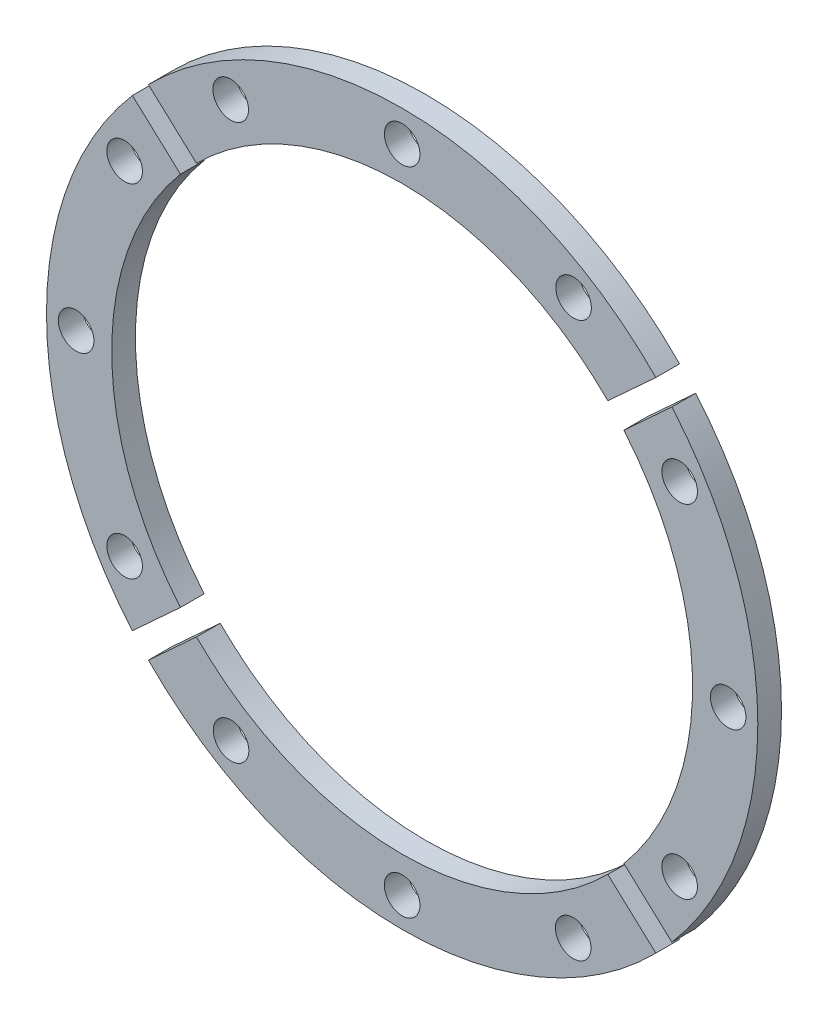
ISO-10303-21;
HEADER;
FILE_DESCRIPTION(('STEP AP214'),'2;1');
FILE_NAME('part.step','',(''),(''),'','','');
FILE_SCHEMA(('AUTOMOTIVE_DESIGN { 1 0 10303 214 1 1 1 1 }'));
ENDSEC;
DATA;
#1=APPLICATION_CONTEXT('core data for automotive mechanical design processes');
#2=APPLICATION_PROTOCOL_DEFINITION('international standard','automotive_design',2000,#1);
#3=PRODUCT_CONTEXT('',#1,'mechanical');
#4=PRODUCT('Part','Part','',(#3));
#5=PRODUCT_RELATED_PRODUCT_CATEGORY('part','',(#4));
#6=PRODUCT_DEFINITION_FORMATION('','',#4);
#7=PRODUCT_DEFINITION_CONTEXT('part definition',#1,'design');
#8=PRODUCT_DEFINITION('design','',#6,#7);
#9=PRODUCT_DEFINITION_SHAPE('','',#8);
#10=(LENGTH_UNIT() NAMED_UNIT(*) SI_UNIT(.MILLI.,.METRE.));
#11=(NAMED_UNIT(*) PLANE_ANGLE_UNIT() SI_UNIT($,.RADIAN.));
#12=(NAMED_UNIT(*) SI_UNIT($,.STERADIAN.) SOLID_ANGLE_UNIT());
#13=UNCERTAINTY_MEASURE_WITH_UNIT(LENGTH_MEASURE(1.E-05),#10,'distance_accuracy_value','');
#14=(GEOMETRIC_REPRESENTATION_CONTEXT(3) GLOBAL_UNCERTAINTY_ASSIGNED_CONTEXT((#13)) GLOBAL_UNIT_ASSIGNED_CONTEXT((#10,
#11,#12)) REPRESENTATION_CONTEXT('',''));
#15=CARTESIAN_POINT('',(0.,0.,0.));
#16=DIRECTION('',(0.,0.,1.));
#17=DIRECTION('',(1.,0.,0.));
#18=AXIS2_PLACEMENT_3D('',#15,#16,#17);
#19=CARTESIAN_POINT('',(0.,0.,20.));
#20=DIRECTION('',(0.,0.,-1.));
#21=DIRECTION('',(-1.,0.,0.));
#22=AXIS2_PLACEMENT_3D('',#19,#20,#21);
#23=CYLINDRICAL_SURFACE('',#22,245.);
#24=CARTESIAN_POINT('',(0.,0.,0.));
#25=DIRECTION('',(0.,0.,1.));
#26=DIRECTION('',(1.,0.,0.));
#27=AXIS2_PLACEMENT_3D('',#24,#25,#26);
#28=CIRCLE('',#27,245.);
#29=CARTESIAN_POINT('',(-173.489080918712,-172.992886564682,0.));
#30=VERTEX_POINT('',#29);
#31=CARTESIAN_POINT('',(173.489080918712,-172.992886564682,0.));
#32=VERTEX_POINT('',#31);
#33=EDGE_CURVE('E218',#30,#32,#28,.T.);
#34=ORIENTED_EDGE('',*,*,#33,.F.);
#35=DIRECTION('',(0.,0.,-1.));
#36=VECTOR('',#35,1.);
#37=CARTESIAN_POINT('',(-173.489080918712,-172.992886564682,20.));
#38=LINE('',#37,#36);
#39=CARTESIAN_POINT('',(-173.489080918712,-172.992886564682,20.));
#40=VERTEX_POINT('',#39);
#41=EDGE_CURVE('E13',#40,#30,#38,.T.);
#42=ORIENTED_EDGE('',*,*,#41,.F.);
#43=CARTESIAN_POINT('',(0.,0.,20.));
#44=DIRECTION('',(0.,0.,1.));
#45=DIRECTION('',(1.,0.,0.));
#46=AXIS2_PLACEMENT_3D('',#43,#44,#45);
#47=CIRCLE('',#46,245.);
#48=CARTESIAN_POINT('',(173.489080918712,-172.992886564682,20.));
#49=VERTEX_POINT('',#48);
#50=EDGE_CURVE('E202',#40,#49,#47,.T.);
#51=ORIENTED_EDGE('',*,*,#50,.T.);
#52=DIRECTION('',(0.,0.,-1.));
#53=VECTOR('',#52,1.);
#54=CARTESIAN_POINT('',(173.489080918712,-172.992886564682,20.));
#55=LINE('',#54,#53);
#56=EDGE_CURVE('E181',#49,#32,#55,.T.);
#57=ORIENTED_EDGE('',*,*,#56,.T.);
#58=EDGE_LOOP('',(#34,#42,#51,#57));
#59=FACE_BOUND('',#58,.T.);
#60=ADVANCED_FACE('F141',(#59),#23,.F.);
#61=CARTESIAN_POINT('',(6.76602199283932,-7.3634873797958,20.));
#62=DIRECTION('',(-0.676602199283941,0.73634873797959,0.));
#63=DIRECTION('',(-0.73634873797959,-0.676602199283941,0.));
#64=AXIS2_PLACEMENT_3D('',#61,#62,#63);
#65=PLANE('',#64);
#66=DIRECTION('',(0.73634873797959,0.676602199283941,0.));
#67=VECTOR('',#66,1.);
#68=CARTESIAN_POINT('',(6.76602199283932,-7.3634873797958,0.));
#69=LINE('',#68,#67);
#70=CARTESIAN_POINT('',(-214.015840502203,-210.231348790174,0.));
#71=VERTEX_POINT('',#70);
#72=EDGE_CURVE('E193',#71,#30,#69,.T.);
#73=ORIENTED_EDGE('',*,*,#72,.F.);
#74=DIRECTION('',(0.,0.,-1.));
#75=VECTOR('',#74,1.);
#76=CARTESIAN_POINT('',(-214.015840502203,-210.231348790174,20.));
#77=LINE('',#76,#75);
#78=CARTESIAN_POINT('',(-214.015840502203,-210.231348790174,20.));
#79=VERTEX_POINT('',#78);
#80=EDGE_CURVE('E150',#79,#71,#77,.T.);
#81=ORIENTED_EDGE('',*,*,#80,.F.);
#82=DIRECTION('',(0.73634873797959,0.676602199283941,0.));
#83=VECTOR('',#82,1.);
#84=CARTESIAN_POINT('',(6.76602199283932,-7.3634873797958,20.));
#85=LINE('',#84,#83);
#86=EDGE_CURVE('E191',#79,#40,#85,.T.);
#87=ORIENTED_EDGE('',*,*,#86,.T.);
#88=ORIENTED_EDGE('',*,*,#41,.T.);
#89=EDGE_LOOP('',(#73,#81,#87,#88));
#90=FACE_BOUND('',#89,.T.);
#91=ADVANCED_FACE('F189',(#90),#65,.T.);
#92=CARTESIAN_POINT('',(0.,0.,20.));
#93=DIRECTION('',(0.,0.,-1.));
#94=DIRECTION('',(-1.,0.,0.));
#95=AXIS2_PLACEMENT_3D('',#92,#93,#94);
#96=CYLINDRICAL_SURFACE('',#95,300.);
#97=CARTESIAN_POINT('',(0.,0.,0.));
#98=DIRECTION('',(0.,0.,1.));
#99=DIRECTION('',(1.,0.,0.));
#100=AXIS2_PLACEMENT_3D('',#97,#98,#99);
#101=CIRCLE('',#100,300.);
#102=CARTESIAN_POINT('',(214.015840502203,-210.231348790174,0.));
#103=VERTEX_POINT('',#102);
#104=EDGE_CURVE('E221',#71,#103,#101,.T.);
#105=ORIENTED_EDGE('',*,*,#104,.T.);
#106=DIRECTION('',(0.,0.,-1.));
#107=VECTOR('',#106,1.);
#108=CARTESIAN_POINT('',(214.015840502203,-210.231348790174,20.));
#109=LINE('',#108,#107);
#110=CARTESIAN_POINT('',(214.015840502203,-210.231348790174,20.));
#111=VERTEX_POINT('',#110);
#112=EDGE_CURVE('E196',#111,#103,#109,.T.);
#113=ORIENTED_EDGE('',*,*,#112,.F.);
#114=CARTESIAN_POINT('',(0.,0.,20.));
#115=DIRECTION('',(0.,0.,1.));
#116=DIRECTION('',(1.,0.,0.));
#117=AXIS2_PLACEMENT_3D('',#114,#115,#116);
#118=CIRCLE('',#117,300.);
#119=EDGE_CURVE('E198',#79,#111,#118,.T.);
#120=ORIENTED_EDGE('',*,*,#119,.F.);
#121=ORIENTED_EDGE('',*,*,#80,.T.);
#122=EDGE_LOOP('',(#105,#113,#120,#121));
#123=FACE_BOUND('',#122,.T.);
#124=ADVANCED_FACE('F199',(#123),#96,.T.);
#125=CARTESIAN_POINT('',(0.,-275.,20.));
#126=DIRECTION('',(0.,0.,-1.));
#127=DIRECTION('',(-1.,0.,0.));
#128=AXIS2_PLACEMENT_3D('',#125,#126,#127);
#129=CYLINDRICAL_SURFACE('',#128,15.);
#130=CARTESIAN_POINT('',(0.,-275.,20.));
#131=DIRECTION('',(0.,0.,1.));
#132=DIRECTION('',(1.,0.,0.));
#133=AXIS2_PLACEMENT_3D('',#130,#131,#132);
#134=CIRCLE('',#133,15.);
#135=CARTESIAN_POINT('',(15.,-275.,20.));
#136=VERTEX_POINT('',#135);
#137=EDGE_CURVE('E204',#136,#136,#134,.T.);
#138=ORIENTED_EDGE('',*,*,#137,.T.);
#139=EDGE_LOOP('',(#138));
#140=FACE_BOUND('',#139,.T.);
#141=CARTESIAN_POINT('',(0.,-275.,0.));
#142=DIRECTION('',(0.,0.,1.));
#143=DIRECTION('',(1.,0.,0.));
#144=AXIS2_PLACEMENT_3D('',#141,#142,#143);
#145=CIRCLE('',#144,15.);
#146=CARTESIAN_POINT('',(15.,-275.,0.));
#147=VERTEX_POINT('',#146);
#148=EDGE_CURVE('E215',#147,#147,#145,.T.);
#149=ORIENTED_EDGE('',*,*,#148,.F.);
#150=EDGE_LOOP('',(#149));
#151=FACE_BOUND('',#150,.T.);
#152=ADVANCED_FACE('F237',(#140,#151),#129,.F.);
#153=CARTESIAN_POINT('',(144.31370787625,-234.090909090909,20.));
#154=DIRECTION('',(0.,0.,-1.));
#155=DIRECTION('',(-1.,0.,0.));
#156=AXIS2_PLACEMENT_3D('',#153,#154,#155);
#157=CYLINDRICAL_SURFACE('',#156,15.);
#158=CARTESIAN_POINT('',(144.31370787625,-234.090909090909,20.));
#159=DIRECTION('',(0.,0.,1.));
#160=DIRECTION('',(1.,0.,0.));
#161=AXIS2_PLACEMENT_3D('',#158,#159,#160);
#162=CIRCLE('',#161,15.);
#163=CARTESIAN_POINT('',(159.31370787625,-234.090909090909,20.));
#164=VERTEX_POINT('',#163);
#165=EDGE_CURVE('E250',#164,#164,#162,.T.);
#166=ORIENTED_EDGE('',*,*,#165,.T.);
#167=EDGE_LOOP('',(#166));
#168=FACE_BOUND('',#167,.T.);
#169=CARTESIAN_POINT('',(144.31370787625,-234.090909090909,0.));
#170=DIRECTION('',(0.,0.,1.));
#171=DIRECTION('',(1.,0.,0.));
#172=AXIS2_PLACEMENT_3D('',#169,#170,#171);
#173=CIRCLE('',#172,15.);
#174=CARTESIAN_POINT('',(159.31370787625,-234.090909090909,0.));
#175=VERTEX_POINT('',#174);
#176=EDGE_CURVE('E212',#175,#175,#173,.T.);
#177=ORIENTED_EDGE('',*,*,#176,.F.);
#178=EDGE_LOOP('',(#177));
#179=FACE_BOUND('',#178,.T.);
#180=ADVANCED_FACE('F239',(#168,#179),#157,.F.);
#181=CARTESIAN_POINT('',(-144.31370787625,-234.090909090909,20.));
#182=DIRECTION('',(0.,0.,-1.));
#183=DIRECTION('',(-1.,0.,0.));
#184=AXIS2_PLACEMENT_3D('',#181,#182,#183);
#185=CYLINDRICAL_SURFACE('',#184,15.);
#186=CARTESIAN_POINT('',(-144.31370787625,-234.090909090909,20.));
#187=DIRECTION('',(0.,0.,1.));
#188=DIRECTION('',(1.,0.,0.));
#189=AXIS2_PLACEMENT_3D('',#186,#187,#188);
#190=CIRCLE('',#189,15.);
#191=CARTESIAN_POINT('',(-129.31370787625,-234.090909090909,20.));
#192=VERTEX_POINT('',#191);
#193=EDGE_CURVE('E224',#192,#192,#190,.T.);
#194=ORIENTED_EDGE('',*,*,#193,.T.);
#195=EDGE_LOOP('',(#194));
#196=FACE_BOUND('',#195,.T.);
#197=CARTESIAN_POINT('',(-144.31370787625,-234.090909090909,0.));
#198=DIRECTION('',(0.,0.,1.));
#199=DIRECTION('',(1.,0.,0.));
#200=AXIS2_PLACEMENT_3D('',#197,#198,#199);
#201=CIRCLE('',#200,15.);
#202=CARTESIAN_POINT('',(-129.31370787625,-234.090909090909,0.));
#203=VERTEX_POINT('',#202);
#204=EDGE_CURVE('E209',#203,#203,#201,.T.);
#205=ORIENTED_EDGE('',*,*,#204,.F.);
#206=EDGE_LOOP('',(#205));
#207=FACE_BOUND('',#206,.T.);
#208=ADVANCED_FACE('F143',(#196,#207),#185,.F.);
#209=CARTESIAN_POINT('',(-6.76602199283932,-7.3634873797958,20.));
#210=DIRECTION('',(-0.676602199283941,-0.73634873797959,0.));
#211=DIRECTION('',(0.73634873797959,-0.676602199283941,0.));
#212=AXIS2_PLACEMENT_3D('',#209,#210,#211);
#213=PLANE('',#212);
#214=DIRECTION('',(-0.73634873797959,0.676602199283941,0.));
#215=VECTOR('',#214,1.);
#216=CARTESIAN_POINT('',(-6.76602199283932,-7.3634873797958,0.));
#217=LINE('',#216,#215);
#218=EDGE_CURVE('E174',#103,#32,#217,.T.);
#219=ORIENTED_EDGE('',*,*,#218,.T.);
#220=ORIENTED_EDGE('',*,*,#56,.F.);
#221=DIRECTION('',(-0.73634873797959,0.676602199283941,0.));
#222=VECTOR('',#221,1.);
#223=CARTESIAN_POINT('',(-6.76602199283932,-7.3634873797958,20.));
#224=LINE('',#223,#222);
#225=EDGE_CURVE('E158',#111,#49,#224,.T.);
#226=ORIENTED_EDGE('',*,*,#225,.F.);
#227=ORIENTED_EDGE('',*,*,#112,.T.);
#228=EDGE_LOOP('',(#219,#220,#226,#227));
#229=FACE_BOUND('',#228,.T.);
#230=ADVANCED_FACE('F227',(#229),#213,.F.);
#231=CARTESIAN_POINT('',(0.,0.,20.));
#232=DIRECTION('',(0.,0.,1.));
#233=DIRECTION('',(1.,0.,0.));
#234=AXIS2_PLACEMENT_3D('',#231,#232,#233);
#235=PLANE('',#234);
#236=ORIENTED_EDGE('',*,*,#193,.F.);
#237=EDGE_LOOP('',(#236));
#238=FACE_BOUND('',#237,.T.);
#239=ORIENTED_EDGE('',*,*,#165,.F.);
#240=EDGE_LOOP('',(#239));
#241=FACE_BOUND('',#240,.T.);
#242=ORIENTED_EDGE('',*,*,#137,.F.);
#243=EDGE_LOOP('',(#242));
#244=FACE_BOUND('',#243,.T.);
#245=ORIENTED_EDGE('',*,*,#50,.F.);
#246=ORIENTED_EDGE('',*,*,#86,.F.);
#247=ORIENTED_EDGE('',*,*,#119,.T.);
#248=ORIENTED_EDGE('',*,*,#225,.T.);
#249=EDGE_LOOP('',(#245,#246,#247,#248));
#250=FACE_BOUND('',#249,.T.);
#251=ADVANCED_FACE('F201',(#238,#241,#244,#250),#235,.T.);
#252=CARTESIAN_POINT('',(0.,0.,0.));
#253=DIRECTION('',(0.,0.,1.));
#254=DIRECTION('',(1.,0.,0.));
#255=AXIS2_PLACEMENT_3D('',#252,#253,#254);
#256=PLANE('',#255);
#257=ORIENTED_EDGE('',*,*,#204,.T.);
#258=EDGE_LOOP('',(#257));
#259=FACE_BOUND('',#258,.T.);
#260=ORIENTED_EDGE('',*,*,#176,.T.);
#261=EDGE_LOOP('',(#260));
#262=FACE_BOUND('',#261,.T.);
#263=ORIENTED_EDGE('',*,*,#148,.T.);
#264=EDGE_LOOP('',(#263));
#265=FACE_BOUND('',#264,.T.);
#266=ORIENTED_EDGE('',*,*,#33,.T.);
#267=ORIENTED_EDGE('',*,*,#218,.F.);
#268=ORIENTED_EDGE('',*,*,#104,.F.);
#269=ORIENTED_EDGE('',*,*,#72,.T.);
#270=EDGE_LOOP('',(#266,#267,#268,#269));
#271=FACE_BOUND('',#270,.T.);
#272=ADVANCED_FACE('F228',(#259,#262,#265,#271),#256,.F.);
#273=CLOSED_SHELL('',(#60,#91,#124,#152,#180,#208,#230,#251,#272));
#274=MANIFOLD_SOLID_BREP('B2',#273);
#275=CARTESIAN_POINT('',(6.76602199283945,7.36348737979595,20.));
#276=DIRECTION('',(-0.67660219928394,-0.73634873797959,0.));
#277=DIRECTION('',(0.73634873797959,-0.67660219928394,0.));
#278=AXIS2_PLACEMENT_3D('',#275,#276,#277);
#279=PLANE('',#278);
#280=DIRECTION('',(-0.73634873797959,0.67660219928394,0.));
#281=VECTOR('',#280,1.);
#282=CARTESIAN_POINT('',(6.76602199283945,7.36348737979595,0.));
#283=LINE('',#282,#281);
#284=CARTESIAN_POINT('',(227.547884487882,-195.504374030582,0.));
#285=VERTEX_POINT('',#284);
#286=CARTESIAN_POINT('',(187.02112490439,-158.26591180509,0.));
#287=VERTEX_POINT('',#286);
#288=EDGE_CURVE('E408',#285,#287,#283,.T.);
#289=ORIENTED_EDGE('',*,*,#288,.F.);
#290=DIRECTION('',(0.,0.,-1.));
#291=VECTOR('',#290,1.);
#292=CARTESIAN_POINT('',(227.547884487882,-195.504374030582,20.));
#293=LINE('',#292,#291);
#294=CARTESIAN_POINT('',(227.547884487882,-195.504374030582,20.));
#295=VERTEX_POINT('',#294);
#296=EDGE_CURVE('E139',#295,#285,#293,.T.);
#297=ORIENTED_EDGE('',*,*,#296,.F.);
#298=DIRECTION('',(-0.73634873797959,0.67660219928394,0.));
#299=VECTOR('',#298,1.);
#300=CARTESIAN_POINT('',(6.76602199283945,7.36348737979595,20.));
#301=LINE('',#300,#299);
#302=CARTESIAN_POINT('',(187.02112490439,-158.26591180509,20.));
#303=VERTEX_POINT('',#302);
#304=EDGE_CURVE('E392',#295,#303,#301,.T.);
#305=ORIENTED_EDGE('',*,*,#304,.T.);
#306=DIRECTION('',(0.,0.,-1.));
#307=VECTOR('',#306,1.);
#308=CARTESIAN_POINT('',(187.02112490439,-158.26591180509,20.));
#309=LINE('',#308,#307);
#310=EDGE_CURVE('E354',#303,#287,#309,.T.);
#311=ORIENTED_EDGE('',*,*,#310,.T.);
#312=EDGE_LOOP('',(#289,#297,#305,#311));
#313=FACE_BOUND('',#312,.T.);
#314=ADVANCED_FACE('F337',(#313),#279,.T.);
#315=CARTESIAN_POINT('',(0.,0.,20.));
#316=DIRECTION('',(0.,0.,-1.));
#317=DIRECTION('',(-1.,0.,0.));
#318=AXIS2_PLACEMENT_3D('',#315,#316,#317);
#319=CYLINDRICAL_SURFACE('',#318,300.);
#320=CARTESIAN_POINT('',(0.,0.,0.));
#321=DIRECTION('',(0.,0.,1.));
#322=DIRECTION('',(1.,0.,0.));
#323=AXIS2_PLACEMENT_3D('',#320,#321,#322);
#324=CIRCLE('',#323,300.);
#325=CARTESIAN_POINT('',(227.547884487882,195.504374030582,0.));
#326=VERTEX_POINT('',#325);
#327=EDGE_CURVE('E397',#285,#326,#324,.T.);
#328=ORIENTED_EDGE('',*,*,#327,.T.);
#329=DIRECTION('',(0.,0.,-1.));
#330=VECTOR('',#329,1.);
#331=CARTESIAN_POINT('',(227.547884487882,195.504374030582,20.));
#332=LINE('',#331,#330);
#333=CARTESIAN_POINT('',(227.547884487882,195.504374030582,20.));
#334=VERTEX_POINT('',#333);
#335=EDGE_CURVE('E346',#334,#326,#332,.T.);
#336=ORIENTED_EDGE('',*,*,#335,.F.);
#337=CARTESIAN_POINT('',(0.,0.,20.));
#338=DIRECTION('',(0.,0.,1.));
#339=DIRECTION('',(1.,0.,0.));
#340=AXIS2_PLACEMENT_3D('',#337,#338,#339);
#341=CIRCLE('',#340,300.);
#342=EDGE_CURVE('E388',#295,#334,#341,.T.);
#343=ORIENTED_EDGE('',*,*,#342,.F.);
#344=ORIENTED_EDGE('',*,*,#296,.T.);
#345=EDGE_LOOP('',(#328,#336,#343,#344));
#346=FACE_BOUND('',#345,.T.);
#347=ADVANCED_FACE('F395',(#346),#319,.T.);
#348=CARTESIAN_POINT('',(6.76602199283945,-7.36348737979595,20.));
#349=DIRECTION('',(0.67660219928394,-0.73634873797959,0.));
#350=DIRECTION('',(0.73634873797959,0.67660219928394,0.));
#351=AXIS2_PLACEMENT_3D('',#348,#349,#350);
#352=PLANE('',#351);
#353=DIRECTION('',(-0.73634873797959,-0.67660219928394,0.));
#354=VECTOR('',#353,1.);
#355=CARTESIAN_POINT('',(6.76602199283945,-7.36348737979595,0.));
#356=LINE('',#355,#354);
#357=CARTESIAN_POINT('',(187.02112490439,158.26591180509,0.));
#358=VERTEX_POINT('',#357);
#359=EDGE_CURVE('E405',#326,#358,#356,.T.);
#360=ORIENTED_EDGE('',*,*,#359,.T.);
#361=DIRECTION('',(0.,0.,-1.));
#362=VECTOR('',#361,1.);
#363=CARTESIAN_POINT('',(187.02112490439,158.26591180509,20.));
#364=LINE('',#363,#362);
#365=CARTESIAN_POINT('',(187.02112490439,158.26591180509,20.));
#366=VERTEX_POINT('',#365);
#367=EDGE_CURVE('E368',#366,#358,#364,.T.);
#368=ORIENTED_EDGE('',*,*,#367,.F.);
#369=DIRECTION('',(-0.73634873797959,-0.67660219928394,0.));
#370=VECTOR('',#369,1.);
#371=CARTESIAN_POINT('',(6.76602199283945,-7.36348737979595,20.));
#372=LINE('',#371,#370);
#373=EDGE_CURVE('E380',#334,#366,#372,.T.);
#374=ORIENTED_EDGE('',*,*,#373,.F.);
#375=ORIENTED_EDGE('',*,*,#335,.T.);
#376=EDGE_LOOP('',(#360,#368,#374,#375));
#377=FACE_BOUND('',#376,.T.);
#378=ADVANCED_FACE('F382',(#377),#352,.F.);
#379=CARTESIAN_POINT('',(234.090909090909,-144.31370787625,20.));
#380=DIRECTION('',(0.,0.,-1.));
#381=DIRECTION('',(-1.,0.,0.));
#382=AXIS2_PLACEMENT_3D('',#379,#380,#381);
#383=CYLINDRICAL_SURFACE('',#382,15.);
#384=CARTESIAN_POINT('',(234.090909090909,-144.31370787625,20.));
#385=DIRECTION('',(0.,0.,1.));
#386=DIRECTION('',(1.,0.,0.));
#387=AXIS2_PLACEMENT_3D('',#384,#385,#386);
#388=CIRCLE('',#387,15.);
#389=CARTESIAN_POINT('',(249.090909090909,-144.31370787625,20.));
#390=VERTEX_POINT('',#389);
#391=EDGE_CURVE('E421',#390,#390,#388,.T.);
#392=ORIENTED_EDGE('',*,*,#391,.T.);
#393=EDGE_LOOP('',(#392));
#394=FACE_BOUND('',#393,.T.);
#395=CARTESIAN_POINT('',(234.090909090909,-144.31370787625,0.));
#396=DIRECTION('',(0.,0.,1.));
#397=DIRECTION('',(1.,0.,0.));
#398=AXIS2_PLACEMENT_3D('',#395,#396,#397);
#399=CIRCLE('',#398,15.);
#400=CARTESIAN_POINT('',(249.090909090909,-144.31370787625,0.));
#401=VERTEX_POINT('',#400);
#402=EDGE_CURVE('E410',#401,#401,#399,.T.);
#403=ORIENTED_EDGE('',*,*,#402,.F.);
#404=EDGE_LOOP('',(#403));
#405=FACE_BOUND('',#404,.T.);
#406=ADVANCED_FACE('F441',(#394,#405),#383,.F.);
#407=CARTESIAN_POINT('',(234.090909090909,144.31370787625,20.));
#408=DIRECTION('',(0.,0.,-1.));
#409=DIRECTION('',(-1.,0.,0.));
#410=AXIS2_PLACEMENT_3D('',#407,#408,#409);
#411=CYLINDRICAL_SURFACE('',#410,15.);
#412=CARTESIAN_POINT('',(234.090909090909,144.31370787625,20.));
#413=DIRECTION('',(0.,0.,1.));
#414=DIRECTION('',(1.,0.,0.));
#415=AXIS2_PLACEMENT_3D('',#412,#413,#414);
#416=CIRCLE('',#415,15.);
#417=CARTESIAN_POINT('',(249.090909090909,144.31370787625,20.));
#418=VERTEX_POINT('',#417);
#419=EDGE_CURVE('E424',#418,#418,#416,.T.);
#420=ORIENTED_EDGE('',*,*,#419,.T.);
#421=EDGE_LOOP('',(#420));
#422=FACE_BOUND('',#421,.T.);
#423=CARTESIAN_POINT('',(234.090909090909,144.31370787625,0.));
#424=DIRECTION('',(0.,0.,1.));
#425=DIRECTION('',(1.,0.,0.));
#426=AXIS2_PLACEMENT_3D('',#423,#424,#425);
#427=CIRCLE('',#426,15.);
#428=CARTESIAN_POINT('',(249.090909090909,144.31370787625,0.));
#429=VERTEX_POINT('',#428);
#430=EDGE_CURVE('E413',#429,#429,#427,.T.);
#431=ORIENTED_EDGE('',*,*,#430,.F.);
#432=EDGE_LOOP('',(#431));
#433=FACE_BOUND('',#432,.T.);
#434=ADVANCED_FACE('F444',(#422,#433),#411,.F.);
#435=CARTESIAN_POINT('',(275.,0.,20.));
#436=DIRECTION('',(0.,0.,-1.));
#437=DIRECTION('',(-1.,0.,0.));
#438=AXIS2_PLACEMENT_3D('',#435,#436,#437);
#439=CYLINDRICAL_SURFACE('',#438,15.);
#440=CARTESIAN_POINT('',(275.,0.,20.));
#441=DIRECTION('',(0.,0.,1.));
#442=DIRECTION('',(1.,0.,0.));
#443=AXIS2_PLACEMENT_3D('',#440,#441,#442);
#444=CIRCLE('',#443,15.);
#445=CARTESIAN_POINT('',(290.,0.,20.));
#446=VERTEX_POINT('',#445);
#447=EDGE_CURVE('E404',#446,#446,#444,.T.);
#448=ORIENTED_EDGE('',*,*,#447,.T.);
#449=EDGE_LOOP('',(#448));
#450=FACE_BOUND('',#449,.T.);
#451=CARTESIAN_POINT('',(275.,0.,0.));
#452=DIRECTION('',(0.,0.,1.));
#453=DIRECTION('',(1.,0.,0.));
#454=AXIS2_PLACEMENT_3D('',#451,#452,#453);
#455=CIRCLE('',#454,15.);
#456=CARTESIAN_POINT('',(290.,0.,0.));
#457=VERTEX_POINT('',#456);
#458=EDGE_CURVE('E416',#457,#457,#455,.T.);
#459=ORIENTED_EDGE('',*,*,#458,.F.);
#460=EDGE_LOOP('',(#459));
#461=FACE_BOUND('',#460,.T.);
#462=ADVANCED_FACE('F339',(#450,#461),#439,.F.);
#463=CARTESIAN_POINT('',(0.,0.,20.));
#464=DIRECTION('',(0.,0.,-1.));
#465=DIRECTION('',(-1.,0.,0.));
#466=AXIS2_PLACEMENT_3D('',#463,#464,#465);
#467=CYLINDRICAL_SURFACE('',#466,245.);
#468=CARTESIAN_POINT('',(0.,0.,0.));
#469=DIRECTION('',(0.,0.,1.));
#470=DIRECTION('',(1.,0.,0.));
#471=AXIS2_PLACEMENT_3D('',#468,#469,#470);
#472=CIRCLE('',#471,245.);
#473=EDGE_CURVE('E401',#287,#358,#472,.T.);
#474=ORIENTED_EDGE('',*,*,#473,.F.);
#475=ORIENTED_EDGE('',*,*,#310,.F.);
#476=CARTESIAN_POINT('',(0.,0.,20.));
#477=DIRECTION('',(0.,0.,1.));
#478=DIRECTION('',(1.,0.,0.));
#479=AXIS2_PLACEMENT_3D('',#476,#477,#478);
#480=CIRCLE('',#479,245.);
#481=EDGE_CURVE('E387',#303,#366,#480,.T.);
#482=ORIENTED_EDGE('',*,*,#481,.T.);
#483=ORIENTED_EDGE('',*,*,#367,.T.);
#484=EDGE_LOOP('',(#474,#475,#482,#483));
#485=FACE_BOUND('',#484,.T.);
#486=ADVANCED_FACE('F435',(#485),#467,.F.);
#487=CARTESIAN_POINT('',(0.,0.,20.));
#488=DIRECTION('',(0.,0.,1.));
#489=DIRECTION('',(1.,0.,0.));
#490=AXIS2_PLACEMENT_3D('',#487,#488,#489);
#491=PLANE('',#490);
#492=ORIENTED_EDGE('',*,*,#447,.F.);
#493=EDGE_LOOP('',(#492));
#494=FACE_BOUND('',#493,.T.);
#495=ORIENTED_EDGE('',*,*,#419,.F.);
#496=EDGE_LOOP('',(#495));
#497=FACE_BOUND('',#496,.T.);
#498=ORIENTED_EDGE('',*,*,#391,.F.);
#499=EDGE_LOOP('',(#498));
#500=FACE_BOUND('',#499,.T.);
#501=ORIENTED_EDGE('',*,*,#304,.F.);
#502=ORIENTED_EDGE('',*,*,#342,.T.);
#503=ORIENTED_EDGE('',*,*,#373,.T.);
#504=ORIENTED_EDGE('',*,*,#481,.F.);
#505=EDGE_LOOP('',(#501,#502,#503,#504));
#506=FACE_BOUND('',#505,.T.);
#507=ADVANCED_FACE('F391',(#494,#497,#500,#506),#491,.T.);
#508=CARTESIAN_POINT('',(0.,0.,0.));
#509=DIRECTION('',(0.,0.,1.));
#510=DIRECTION('',(1.,0.,0.));
#511=AXIS2_PLACEMENT_3D('',#508,#509,#510);
#512=PLANE('',#511);
#513=ORIENTED_EDGE('',*,*,#458,.T.);
#514=EDGE_LOOP('',(#513));
#515=FACE_BOUND('',#514,.T.);
#516=ORIENTED_EDGE('',*,*,#430,.T.);
#517=EDGE_LOOP('',(#516));
#518=FACE_BOUND('',#517,.T.);
#519=ORIENTED_EDGE('',*,*,#402,.T.);
#520=EDGE_LOOP('',(#519));
#521=FACE_BOUND('',#520,.T.);
#522=ORIENTED_EDGE('',*,*,#288,.T.);
#523=ORIENTED_EDGE('',*,*,#473,.T.);
#524=ORIENTED_EDGE('',*,*,#359,.F.);
#525=ORIENTED_EDGE('',*,*,#327,.F.);
#526=EDGE_LOOP('',(#522,#523,#524,#525));
#527=FACE_BOUND('',#526,.T.);
#528=ADVANCED_FACE('F434',(#515,#518,#521,#527),#512,.F.);
#529=CLOSED_SHELL('',(#314,#347,#378,#406,#434,#462,#486,#507,#528));
#530=MANIFOLD_SOLID_BREP('B7',#529);
#531=CARTESIAN_POINT('',(0.,0.,20.));
#532=DIRECTION('',(0.,0.,-1.));
#533=DIRECTION('',(-1.,0.,0.));
#534=AXIS2_PLACEMENT_3D('',#531,#532,#533);
#535=CYLINDRICAL_SURFACE('',#534,245.);
#536=CARTESIAN_POINT('',(0.,0.,0.));
#537=DIRECTION('',(0.,0.,1.));
#538=DIRECTION('',(1.,0.,0.));
#539=AXIS2_PLACEMENT_3D('',#536,#537,#538);
#540=CIRCLE('',#539,245.);
#541=CARTESIAN_POINT('',(173.489080918712,172.992886564682,0.));
#542=VERTEX_POINT('',#541);
#543=CARTESIAN_POINT('',(-173.489080918712,172.992886564682,0.));
#544=VERTEX_POINT('',#543);
#545=EDGE_CURVE('E605',#542,#544,#540,.T.);
#546=ORIENTED_EDGE('',*,*,#545,.F.);
#547=DIRECTION('',(0.,0.,-1.));
#548=VECTOR('',#547,1.);
#549=CARTESIAN_POINT('',(173.489080918712,172.992886564682,20.));
#550=LINE('',#549,#548);
#551=CARTESIAN_POINT('',(173.489080918712,172.992886564682,20.));
#552=VERTEX_POINT('',#551);
#553=EDGE_CURVE('E335',#552,#542,#550,.T.);
#554=ORIENTED_EDGE('',*,*,#553,.F.);
#555=CARTESIAN_POINT('',(0.,0.,20.));
#556=DIRECTION('',(0.,0.,1.));
#557=DIRECTION('',(1.,0.,0.));
#558=AXIS2_PLACEMENT_3D('',#555,#556,#557);
#559=CIRCLE('',#558,245.);
#560=CARTESIAN_POINT('',(-173.489080918712,172.992886564682,20.));
#561=VERTEX_POINT('',#560);
#562=EDGE_CURVE('E590',#552,#561,#559,.T.);
#563=ORIENTED_EDGE('',*,*,#562,.T.);
#564=DIRECTION('',(0.,0.,-1.));
#565=VECTOR('',#564,1.);
#566=CARTESIAN_POINT('',(-173.489080918712,172.992886564682,20.));
#567=LINE('',#566,#565);
#568=EDGE_CURVE('E570',#561,#544,#567,.T.);
#569=ORIENTED_EDGE('',*,*,#568,.T.);
#570=EDGE_LOOP('',(#546,#554,#563,#569));
#571=FACE_BOUND('',#570,.T.);
#572=ADVANCED_FACE('F532',(#571),#535,.F.);
#573=CARTESIAN_POINT('',(-6.76602199283932,7.3634873797958,20.));
#574=DIRECTION('',(0.676602199283941,-0.73634873797959,0.));
#575=DIRECTION('',(0.73634873797959,0.676602199283941,0.));
#576=AXIS2_PLACEMENT_3D('',#573,#574,#575);
#577=PLANE('',#576);
#578=DIRECTION('',(-0.73634873797959,-0.676602199283941,0.));
#579=VECTOR('',#578,1.);
#580=CARTESIAN_POINT('',(-6.76602199283932,7.3634873797958,0.));
#581=LINE('',#580,#579);
#582=CARTESIAN_POINT('',(214.015840502203,210.231348790174,0.));
#583=VERTEX_POINT('',#582);
#584=EDGE_CURVE('E583',#583,#542,#581,.T.);
#585=ORIENTED_EDGE('',*,*,#584,.F.);
#586=DIRECTION('',(0.,0.,-1.));
#587=VECTOR('',#586,1.);
#588=CARTESIAN_POINT('',(214.015840502203,210.231348790174,20.));
#589=LINE('',#588,#587);
#590=CARTESIAN_POINT('',(214.015840502203,210.231348790174,20.));
#591=VERTEX_POINT('',#590);
#592=EDGE_CURVE('E540',#591,#583,#589,.T.);
#593=ORIENTED_EDGE('',*,*,#592,.F.);
#594=DIRECTION('',(-0.73634873797959,-0.676602199283941,0.));
#595=VECTOR('',#594,1.);
#596=CARTESIAN_POINT('',(-6.76602199283932,7.3634873797958,20.));
#597=LINE('',#596,#595);
#598=EDGE_CURVE('E581',#591,#552,#597,.T.);
#599=ORIENTED_EDGE('',*,*,#598,.T.);
#600=ORIENTED_EDGE('',*,*,#553,.T.);
#601=EDGE_LOOP('',(#585,#593,#599,#600));
#602=FACE_BOUND('',#601,.T.);
#603=ADVANCED_FACE('F579',(#602),#577,.T.);
#604=CARTESIAN_POINT('',(0.,0.,20.));
#605=DIRECTION('',(0.,0.,-1.));
#606=DIRECTION('',(-1.,0.,0.));
#607=AXIS2_PLACEMENT_3D('',#604,#605,#606);
#608=CYLINDRICAL_SURFACE('',#607,300.);
#609=CARTESIAN_POINT('',(0.,0.,0.));
#610=DIRECTION('',(0.,0.,1.));
#611=DIRECTION('',(1.,0.,0.));
#612=AXIS2_PLACEMENT_3D('',#609,#610,#611);
#613=CIRCLE('',#612,300.);
#614=CARTESIAN_POINT('',(-214.015840502203,210.231348790174,0.));
#615=VERTEX_POINT('',#614);
#616=EDGE_CURVE('E563',#583,#615,#613,.T.);
#617=ORIENTED_EDGE('',*,*,#616,.T.);
#618=DIRECTION('',(0.,0.,-1.));
#619=VECTOR('',#618,1.);
#620=CARTESIAN_POINT('',(-214.015840502203,210.231348790174,20.));
#621=LINE('',#620,#619);
#622=CARTESIAN_POINT('',(-214.015840502203,210.231348790174,20.));
#623=VERTEX_POINT('',#622);
#624=EDGE_CURVE('E584',#623,#615,#621,.T.);
#625=ORIENTED_EDGE('',*,*,#624,.F.);
#626=CARTESIAN_POINT('',(0.,0.,20.));
#627=DIRECTION('',(0.,0.,1.));
#628=DIRECTION('',(1.,0.,0.));
#629=AXIS2_PLACEMENT_3D('',#626,#627,#628);
#630=CIRCLE('',#629,300.);
#631=EDGE_CURVE('E585',#591,#623,#630,.T.);
#632=ORIENTED_EDGE('',*,*,#631,.F.);
#633=ORIENTED_EDGE('',*,*,#592,.T.);
#634=EDGE_LOOP('',(#617,#625,#632,#633));
#635=FACE_BOUND('',#634,.T.);
#636=ADVANCED_FACE('F586',(#635),#608,.T.);
#637=CARTESIAN_POINT('',(-144.598899786363,233.914852415518,20.));
#638=DIRECTION('',(0.,0.,-1.));
#639=DIRECTION('',(-1.,0.,0.));
#640=AXIS2_PLACEMENT_3D('',#637,#638,#639);
#641=CYLINDRICAL_SURFACE('',#640,15.);
#642=CARTESIAN_POINT('',(-144.598899786363,233.914852415518,20.));
#643=DIRECTION('',(0.,0.,1.));
#644=DIRECTION('',(1.,0.,0.));
#645=AXIS2_PLACEMENT_3D('',#642,#643,#644);
#646=CIRCLE('',#645,15.);
#647=CARTESIAN_POINT('',(-129.598899786363,233.914852415518,20.));
#648=VERTEX_POINT('',#647);
#649=EDGE_CURVE('E599',#648,#648,#646,.T.);
#650=ORIENTED_EDGE('',*,*,#649,.T.);
#651=EDGE_LOOP('',(#650));
#652=FACE_BOUND('',#651,.T.);
#653=CARTESIAN_POINT('',(-144.598899786363,233.914852415518,0.));
#654=DIRECTION('',(0.,0.,1.));
#655=DIRECTION('',(1.,0.,0.));
#656=AXIS2_PLACEMENT_3D('',#653,#654,#655);
#657=CIRCLE('',#656,15.);
#658=CARTESIAN_POINT('',(-129.598899786363,233.914852415518,0.));
#659=VERTEX_POINT('',#658);
#660=EDGE_CURVE('E615',#659,#659,#657,.T.);
#661=ORIENTED_EDGE('',*,*,#660,.F.);
#662=EDGE_LOOP('',(#661));
#663=FACE_BOUND('',#662,.T.);
#664=ADVANCED_FACE('F634',(#652,#663),#641,.F.);
#665=CARTESIAN_POINT('',(144.598899786363,233.914852415518,20.));
#666=DIRECTION('',(0.,0.,-1.));
#667=DIRECTION('',(-1.,0.,0.));
#668=AXIS2_PLACEMENT_3D('',#665,#666,#667);
#669=CYLINDRICAL_SURFACE('',#668,15.);
#670=CARTESIAN_POINT('',(144.598899786363,233.914852415518,20.));
#671=DIRECTION('',(0.,0.,1.));
#672=DIRECTION('',(1.,0.,0.));
#673=AXIS2_PLACEMENT_3D('',#670,#671,#672);
#674=CIRCLE('',#673,15.);
#675=CARTESIAN_POINT('',(159.598899786363,233.914852415518,20.));
#676=VERTEX_POINT('',#675);
#677=EDGE_CURVE('E596',#676,#676,#674,.T.);
#678=ORIENTED_EDGE('',*,*,#677,.T.);
#679=EDGE_LOOP('',(#678));
#680=FACE_BOUND('',#679,.T.);
#681=CARTESIAN_POINT('',(144.598899786363,233.914852415518,0.));
#682=DIRECTION('',(0.,0.,1.));
#683=DIRECTION('',(1.,0.,0.));
#684=AXIS2_PLACEMENT_3D('',#681,#682,#683);
#685=CIRCLE('',#684,15.);
#686=CARTESIAN_POINT('',(159.598899786363,233.914852415518,0.));
#687=VERTEX_POINT('',#686);
#688=EDGE_CURVE('E612',#687,#687,#685,.T.);
#689=ORIENTED_EDGE('',*,*,#688,.F.);
#690=EDGE_LOOP('',(#689));
#691=FACE_BOUND('',#690,.T.);
#692=ADVANCED_FACE('F640',(#680,#691),#669,.F.);
#693=CARTESIAN_POINT('',(6.76602199283932,7.3634873797958,20.));
#694=DIRECTION('',(0.676602199283941,0.73634873797959,0.));
#695=DIRECTION('',(-0.73634873797959,0.676602199283941,0.));
#696=AXIS2_PLACEMENT_3D('',#693,#694,#695);
#697=PLANE('',#696);
#698=DIRECTION('',(0.73634873797959,-0.676602199283941,0.));
#699=VECTOR('',#698,1.);
#700=CARTESIAN_POINT('',(6.76602199283932,7.3634873797958,0.));
#701=LINE('',#700,#699);
#702=EDGE_CURVE('E610',#615,#544,#701,.T.);
#703=ORIENTED_EDGE('',*,*,#702,.T.);
#704=ORIENTED_EDGE('',*,*,#568,.F.);
#705=DIRECTION('',(0.73634873797959,-0.676602199283941,0.));
#706=VECTOR('',#705,1.);
#707=CARTESIAN_POINT('',(6.76602199283932,7.3634873797958,20.));
#708=LINE('',#707,#706);
#709=EDGE_CURVE('E548',#623,#561,#708,.T.);
#710=ORIENTED_EDGE('',*,*,#709,.F.);
#711=ORIENTED_EDGE('',*,*,#624,.T.);
#712=EDGE_LOOP('',(#703,#704,#710,#711));
#713=FACE_BOUND('',#712,.T.);
#714=ADVANCED_FACE('F623',(#713),#697,.F.);
#715=CARTESIAN_POINT('',(0.,273.804176558367,20.));
#716=DIRECTION('',(0.,0.,-1.));
#717=DIRECTION('',(-1.,0.,0.));
#718=AXIS2_PLACEMENT_3D('',#715,#716,#717);
#719=CYLINDRICAL_SURFACE('',#718,15.);
#720=CARTESIAN_POINT('',(0.,273.804176558367,20.));
#721=DIRECTION('',(0.,0.,1.));
#722=DIRECTION('',(1.,0.,0.));
#723=AXIS2_PLACEMENT_3D('',#720,#721,#722);
#724=CIRCLE('',#723,15.);
#725=CARTESIAN_POINT('',(15.,273.804176558367,20.));
#726=VERTEX_POINT('',#725);
#727=EDGE_CURVE('E602',#726,#726,#724,.T.);
#728=ORIENTED_EDGE('',*,*,#727,.T.);
#729=EDGE_LOOP('',(#728));
#730=FACE_BOUND('',#729,.T.);
#731=CARTESIAN_POINT('',(0.,273.804176558367,0.));
#732=DIRECTION('',(0.,0.,1.));
#733=DIRECTION('',(1.,0.,0.));
#734=AXIS2_PLACEMENT_3D('',#731,#732,#733);
#735=CIRCLE('',#734,15.);
#736=CARTESIAN_POINT('',(15.,273.804176558367,0.));
#737=VERTEX_POINT('',#736);
#738=EDGE_CURVE('E592',#737,#737,#735,.T.);
#739=ORIENTED_EDGE('',*,*,#738,.F.);
#740=EDGE_LOOP('',(#739));
#741=FACE_BOUND('',#740,.T.);
#742=ADVANCED_FACE('F639',(#730,#741),#719,.F.);
#743=CARTESIAN_POINT('',(0.,0.,20.));
#744=DIRECTION('',(0.,0.,1.));
#745=DIRECTION('',(1.,0.,0.));
#746=AXIS2_PLACEMENT_3D('',#743,#744,#745);
#747=PLANE('',#746);
#748=ORIENTED_EDGE('',*,*,#562,.F.);
#749=ORIENTED_EDGE('',*,*,#598,.F.);
#750=ORIENTED_EDGE('',*,*,#631,.T.);
#751=ORIENTED_EDGE('',*,*,#709,.T.);
#752=EDGE_LOOP('',(#748,#749,#750,#751));
#753=FACE_BOUND('',#752,.T.);
#754=ORIENTED_EDGE('',*,*,#677,.F.);
#755=EDGE_LOOP('',(#754));
#756=FACE_BOUND('',#755,.T.);
#757=ORIENTED_EDGE('',*,*,#649,.F.);
#758=EDGE_LOOP('',(#757));
#759=FACE_BOUND('',#758,.T.);
#760=ORIENTED_EDGE('',*,*,#727,.F.);
#761=EDGE_LOOP('',(#760));
#762=FACE_BOUND('',#761,.T.);
#763=ADVANCED_FACE('F588',(#753,#756,#759,#762),#747,.T.);
#764=CARTESIAN_POINT('',(0.,0.,0.));
#765=DIRECTION('',(0.,0.,1.));
#766=DIRECTION('',(1.,0.,0.));
#767=AXIS2_PLACEMENT_3D('',#764,#765,#766);
#768=PLANE('',#767);
#769=ORIENTED_EDGE('',*,*,#545,.T.);
#770=ORIENTED_EDGE('',*,*,#702,.F.);
#771=ORIENTED_EDGE('',*,*,#616,.F.);
#772=ORIENTED_EDGE('',*,*,#584,.T.);
#773=EDGE_LOOP('',(#769,#770,#771,#772));
#774=FACE_BOUND('',#773,.T.);
#775=ORIENTED_EDGE('',*,*,#688,.T.);
#776=EDGE_LOOP('',(#775));
#777=FACE_BOUND('',#776,.T.);
#778=ORIENTED_EDGE('',*,*,#660,.T.);
#779=EDGE_LOOP('',(#778));
#780=FACE_BOUND('',#779,.T.);
#781=ORIENTED_EDGE('',*,*,#738,.T.);
#782=EDGE_LOOP('',(#781));
#783=FACE_BOUND('',#782,.T.);
#784=ADVANCED_FACE('F625',(#774,#777,#780,#783),#768,.F.);
#785=CLOSED_SHELL('',(#572,#603,#636,#664,#692,#714,#742,#763,#784));
#786=MANIFOLD_SOLID_BREP('B133',#785);
#787=CARTESIAN_POINT('',(-6.76602199283947,-7.36348737979597,20.));
#788=DIRECTION('',(0.676602199283941,0.73634873797959,0.));
#789=DIRECTION('',(-0.73634873797959,0.676602199283941,0.));
#790=AXIS2_PLACEMENT_3D('',#787,#788,#789);
#791=PLANE('',#790);
#792=DIRECTION('',(0.73634873797959,-0.676602199283941,0.));
#793=VECTOR('',#792,1.);
#794=CARTESIAN_POINT('',(-6.76602199283947,-7.36348737979597,0.));
#795=LINE('',#794,#793);
#796=CARTESIAN_POINT('',(-227.547884487882,195.504374030582,0.));
#797=VERTEX_POINT('',#796);
#798=CARTESIAN_POINT('',(-187.02112490439,158.26591180509,0.));
#799=VERTEX_POINT('',#798);
#800=EDGE_CURVE('E789',#797,#799,#795,.T.);
#801=ORIENTED_EDGE('',*,*,#800,.F.);
#802=DIRECTION('',(0.,0.,-1.));
#803=VECTOR('',#802,1.);
#804=CARTESIAN_POINT('',(-227.547884487882,195.504374030582,20.));
#805=LINE('',#804,#803);
#806=CARTESIAN_POINT('',(-227.547884487882,195.504374030582,20.));
#807=VERTEX_POINT('',#806);
#808=EDGE_CURVE('E530',#807,#797,#805,.T.);
#809=ORIENTED_EDGE('',*,*,#808,.F.);
#810=DIRECTION('',(0.73634873797959,-0.676602199283941,0.));
#811=VECTOR('',#810,1.);
#812=CARTESIAN_POINT('',(-6.76602199283947,-7.36348737979597,20.));
#813=LINE('',#812,#811);
#814=CARTESIAN_POINT('',(-187.02112490439,158.26591180509,20.));
#815=VERTEX_POINT('',#814);
#816=EDGE_CURVE('E773',#807,#815,#813,.T.);
#817=ORIENTED_EDGE('',*,*,#816,.T.);
#818=DIRECTION('',(0.,0.,-1.));
#819=VECTOR('',#818,1.);
#820=CARTESIAN_POINT('',(-187.02112490439,158.26591180509,20.));
#821=LINE('',#820,#819);
#822=EDGE_CURVE('E735',#815,#799,#821,.T.);
#823=ORIENTED_EDGE('',*,*,#822,.T.);
#824=EDGE_LOOP('',(#801,#809,#817,#823));
#825=FACE_BOUND('',#824,.T.);
#826=ADVANCED_FACE('F718',(#825),#791,.T.);
#827=CARTESIAN_POINT('',(0.,0.,20.));
#828=DIRECTION('',(0.,0.,-1.));
#829=DIRECTION('',(-1.,0.,0.));
#830=AXIS2_PLACEMENT_3D('',#827,#828,#829);
#831=CYLINDRICAL_SURFACE('',#830,300.);
#832=CARTESIAN_POINT('',(0.,0.,0.));
#833=DIRECTION('',(0.,0.,1.));
#834=DIRECTION('',(1.,0.,0.));
#835=AXIS2_PLACEMENT_3D('',#832,#833,#834);
#836=CIRCLE('',#835,300.);
#837=CARTESIAN_POINT('',(-227.547884487882,-195.504374030582,0.));
#838=VERTEX_POINT('',#837);
#839=EDGE_CURVE('E778',#797,#838,#836,.T.);
#840=ORIENTED_EDGE('',*,*,#839,.T.);
#841=DIRECTION('',(0.,0.,-1.));
#842=VECTOR('',#841,1.);
#843=CARTESIAN_POINT('',(-227.547884487882,-195.504374030582,20.));
#844=LINE('',#843,#842);
#845=CARTESIAN_POINT('',(-227.547884487882,-195.504374030582,20.));
#846=VERTEX_POINT('',#845);
#847=EDGE_CURVE('E727',#846,#838,#844,.T.);
#848=ORIENTED_EDGE('',*,*,#847,.F.);
#849=CARTESIAN_POINT('',(0.,0.,20.));
#850=DIRECTION('',(0.,0.,1.));
#851=DIRECTION('',(1.,0.,0.));
#852=AXIS2_PLACEMENT_3D('',#849,#850,#851);
#853=CIRCLE('',#852,300.);
#854=EDGE_CURVE('E769',#807,#846,#853,.T.);
#855=ORIENTED_EDGE('',*,*,#854,.F.);
#856=ORIENTED_EDGE('',*,*,#808,.T.);
#857=EDGE_LOOP('',(#840,#848,#855,#856));
#858=FACE_BOUND('',#857,.T.);
#859=ADVANCED_FACE('F776',(#858),#831,.T.);
#860=CARTESIAN_POINT('',(-6.76602199283947,7.36348737979597,20.));
#861=DIRECTION('',(-0.676602199283941,0.73634873797959,0.));
#862=DIRECTION('',(-0.73634873797959,-0.676602199283941,0.));
#863=AXIS2_PLACEMENT_3D('',#860,#861,#862);
#864=PLANE('',#863);
#865=DIRECTION('',(0.73634873797959,0.676602199283941,0.));
#866=VECTOR('',#865,1.);
#867=CARTESIAN_POINT('',(-6.76602199283947,7.36348737979597,0.));
#868=LINE('',#867,#866);
#869=CARTESIAN_POINT('',(-187.02112490439,-158.26591180509,0.));
#870=VERTEX_POINT('',#869);
#871=EDGE_CURVE('E786',#838,#870,#868,.T.);
#872=ORIENTED_EDGE('',*,*,#871,.T.);
#873=DIRECTION('',(0.,0.,-1.));
#874=VECTOR('',#873,1.);
#875=CARTESIAN_POINT('',(-187.02112490439,-158.26591180509,20.));
#876=LINE('',#875,#874);
#877=CARTESIAN_POINT('',(-187.02112490439,-158.26591180509,20.));
#878=VERTEX_POINT('',#877);
#879=EDGE_CURVE('E749',#878,#870,#876,.T.);
#880=ORIENTED_EDGE('',*,*,#879,.F.);
#881=DIRECTION('',(0.73634873797959,0.676602199283941,0.));
#882=VECTOR('',#881,1.);
#883=CARTESIAN_POINT('',(-6.76602199283947,7.36348737979597,20.));
#884=LINE('',#883,#882);
#885=EDGE_CURVE('E761',#846,#878,#884,.T.);
#886=ORIENTED_EDGE('',*,*,#885,.F.);
#887=ORIENTED_EDGE('',*,*,#847,.T.);
#888=EDGE_LOOP('',(#872,#880,#886,#887));
#889=FACE_BOUND('',#888,.T.);
#890=ADVANCED_FACE('F763',(#889),#864,.F.);
#891=CARTESIAN_POINT('',(-234.090909090909,144.31370787625,20.));
#892=DIRECTION('',(0.,0.,-1.));
#893=DIRECTION('',(-1.,0.,0.));
#894=AXIS2_PLACEMENT_3D('',#891,#892,#893);
#895=CYLINDRICAL_SURFACE('',#894,15.);
#896=CARTESIAN_POINT('',(-234.090909090909,144.31370787625,20.));
#897=DIRECTION('',(0.,0.,1.));
#898=DIRECTION('',(1.,0.,0.));
#899=AXIS2_PLACEMENT_3D('',#896,#897,#898);
#900=CIRCLE('',#899,15.);
#901=CARTESIAN_POINT('',(-219.090909090909,144.31370787625,20.));
#902=VERTEX_POINT('',#901);
#903=EDGE_CURVE('E802',#902,#902,#900,.T.);
#904=ORIENTED_EDGE('',*,*,#903,.T.);
#905=EDGE_LOOP('',(#904));
#906=FACE_BOUND('',#905,.T.);
#907=CARTESIAN_POINT('',(-234.090909090909,144.31370787625,0.));
#908=DIRECTION('',(0.,0.,1.));
#909=DIRECTION('',(1.,0.,0.));
#910=AXIS2_PLACEMENT_3D('',#907,#908,#909);
#911=CIRCLE('',#910,15.);
#912=CARTESIAN_POINT('',(-219.090909090909,144.31370787625,0.));
#913=VERTEX_POINT('',#912);
#914=EDGE_CURVE('E791',#913,#913,#911,.T.);
#915=ORIENTED_EDGE('',*,*,#914,.F.);
#916=EDGE_LOOP('',(#915));
#917=FACE_BOUND('',#916,.T.);
#918=ADVANCED_FACE('F822',(#906,#917),#895,.F.);
#919=CARTESIAN_POINT('',(-234.090909090909,-144.31370787625,20.));
#920=DIRECTION('',(0.,0.,-1.));
#921=DIRECTION('',(-1.,0.,0.));
#922=AXIS2_PLACEMENT_3D('',#919,#920,#921);
#923=CYLINDRICAL_SURFACE('',#922,15.);
#924=CARTESIAN_POINT('',(-234.090909090909,-144.31370787625,20.));
#925=DIRECTION('',(0.,0.,1.));
#926=DIRECTION('',(1.,0.,0.));
#927=AXIS2_PLACEMENT_3D('',#924,#925,#926);
#928=CIRCLE('',#927,15.);
#929=CARTESIAN_POINT('',(-219.090909090909,-144.31370787625,20.));
#930=VERTEX_POINT('',#929);
#931=EDGE_CURVE('E805',#930,#930,#928,.T.);
#932=ORIENTED_EDGE('',*,*,#931,.T.);
#933=EDGE_LOOP('',(#932));
#934=FACE_BOUND('',#933,.T.);
#935=CARTESIAN_POINT('',(-234.090909090909,-144.31370787625,0.));
#936=DIRECTION('',(0.,0.,1.));
#937=DIRECTION('',(1.,0.,0.));
#938=AXIS2_PLACEMENT_3D('',#935,#936,#937);
#939=CIRCLE('',#938,15.);
#940=CARTESIAN_POINT('',(-219.090909090909,-144.31370787625,0.));
#941=VERTEX_POINT('',#940);
#942=EDGE_CURVE('E794',#941,#941,#939,.T.);
#943=ORIENTED_EDGE('',*,*,#942,.F.);
#944=EDGE_LOOP('',(#943));
#945=FACE_BOUND('',#944,.T.);
#946=ADVANCED_FACE('F825',(#934,#945),#923,.F.);
#947=CARTESIAN_POINT('',(-275.,0.,20.));
#948=DIRECTION('',(0.,0.,-1.));
#949=DIRECTION('',(-1.,0.,0.));
#950=AXIS2_PLACEMENT_3D('',#947,#948,#949);
#951=CYLINDRICAL_SURFACE('',#950,15.);
#952=CARTESIAN_POINT('',(-275.,0.,20.));
#953=DIRECTION('',(0.,0.,1.));
#954=DIRECTION('',(1.,0.,0.));
#955=AXIS2_PLACEMENT_3D('',#952,#953,#954);
#956=CIRCLE('',#955,15.);
#957=CARTESIAN_POINT('',(-260.,0.,20.));
#958=VERTEX_POINT('',#957);
#959=EDGE_CURVE('E785',#958,#958,#956,.T.);
#960=ORIENTED_EDGE('',*,*,#959,.T.);
#961=EDGE_LOOP('',(#960));
#962=FACE_BOUND('',#961,.T.);
#963=CARTESIAN_POINT('',(-275.,0.,0.));
#964=DIRECTION('',(0.,0.,1.));
#965=DIRECTION('',(1.,0.,0.));
#966=AXIS2_PLACEMENT_3D('',#963,#964,#965);
#967=CIRCLE('',#966,15.);
#968=CARTESIAN_POINT('',(-260.,0.,0.));
#969=VERTEX_POINT('',#968);
#970=EDGE_CURVE('E797',#969,#969,#967,.T.);
#971=ORIENTED_EDGE('',*,*,#970,.F.);
#972=EDGE_LOOP('',(#971));
#973=FACE_BOUND('',#972,.T.);
#974=ADVANCED_FACE('F720',(#962,#973),#951,.F.);
#975=CARTESIAN_POINT('',(0.,0.,20.));
#976=DIRECTION('',(0.,0.,-1.));
#977=DIRECTION('',(-1.,0.,0.));
#978=AXIS2_PLACEMENT_3D('',#975,#976,#977);
#979=CYLINDRICAL_SURFACE('',#978,245.);
#980=CARTESIAN_POINT('',(0.,0.,0.));
#981=DIRECTION('',(0.,0.,1.));
#982=DIRECTION('',(1.,0.,0.));
#983=AXIS2_PLACEMENT_3D('',#980,#981,#982);
#984=CIRCLE('',#983,245.);
#985=EDGE_CURVE('E782',#799,#870,#984,.T.);
#986=ORIENTED_EDGE('',*,*,#985,.F.);
#987=ORIENTED_EDGE('',*,*,#822,.F.);
#988=CARTESIAN_POINT('',(0.,0.,20.));
#989=DIRECTION('',(0.,0.,1.));
#990=DIRECTION('',(1.,0.,0.));
#991=AXIS2_PLACEMENT_3D('',#988,#989,#990);
#992=CIRCLE('',#991,245.);
#993=EDGE_CURVE('E768',#815,#878,#992,.T.);
#994=ORIENTED_EDGE('',*,*,#993,.T.);
#995=ORIENTED_EDGE('',*,*,#879,.T.);
#996=EDGE_LOOP('',(#986,#987,#994,#995));
#997=FACE_BOUND('',#996,.T.);
#998=ADVANCED_FACE('F816',(#997),#979,.F.);
#999=CARTESIAN_POINT('',(0.,0.,20.));
#1000=DIRECTION('',(0.,0.,1.));
#1001=DIRECTION('',(1.,0.,0.));
#1002=AXIS2_PLACEMENT_3D('',#999,#1000,#1001);
#1003=PLANE('',#1002);
#1004=ORIENTED_EDGE('',*,*,#959,.F.);
#1005=EDGE_LOOP('',(#1004));
#1006=FACE_BOUND('',#1005,.T.);
#1007=ORIENTED_EDGE('',*,*,#931,.F.);
#1008=EDGE_LOOP('',(#1007));
#1009=FACE_BOUND('',#1008,.T.);
#1010=ORIENTED_EDGE('',*,*,#903,.F.);
#1011=EDGE_LOOP('',(#1010));
#1012=FACE_BOUND('',#1011,.T.);
#1013=ORIENTED_EDGE('',*,*,#816,.F.);
#1014=ORIENTED_EDGE('',*,*,#854,.T.);
#1015=ORIENTED_EDGE('',*,*,#885,.T.);
#1016=ORIENTED_EDGE('',*,*,#993,.F.);
#1017=EDGE_LOOP('',(#1013,#1014,#1015,#1016));
#1018=FACE_BOUND('',#1017,.T.);
#1019=ADVANCED_FACE('F772',(#1006,#1009,#1012,#1018),#1003,.T.);
#1020=CARTESIAN_POINT('',(0.,0.,0.));
#1021=DIRECTION('',(0.,0.,1.));
#1022=DIRECTION('',(1.,0.,0.));
#1023=AXIS2_PLACEMENT_3D('',#1020,#1021,#1022);
#1024=PLANE('',#1023);
#1025=ORIENTED_EDGE('',*,*,#970,.T.);
#1026=EDGE_LOOP('',(#1025));
#1027=FACE_BOUND('',#1026,.T.);
#1028=ORIENTED_EDGE('',*,*,#942,.T.);
#1029=EDGE_LOOP('',(#1028));
#1030=FACE_BOUND('',#1029,.T.);
#1031=ORIENTED_EDGE('',*,*,#914,.T.);
#1032=EDGE_LOOP('',(#1031));
#1033=FACE_BOUND('',#1032,.T.);
#1034=ORIENTED_EDGE('',*,*,#800,.T.);
#1035=ORIENTED_EDGE('',*,*,#985,.T.);
#1036=ORIENTED_EDGE('',*,*,#871,.F.);
#1037=ORIENTED_EDGE('',*,*,#839,.F.);
#1038=EDGE_LOOP('',(#1034,#1035,#1036,#1037));
#1039=FACE_BOUND('',#1038,.T.);
#1040=ADVANCED_FACE('F815',(#1027,#1030,#1033,#1039),#1024,.F.);
#1041=CLOSED_SHELL('',(#826,#859,#890,#918,#946,#974,#998,#1019,#1040));
#1042=MANIFOLD_SOLID_BREP('B329',#1041);
#1043=ADVANCED_BREP_SHAPE_REPRESENTATION('',(#18,#274,#530,#786,#1042),#14);
#1044=SHAPE_DEFINITION_REPRESENTATION(#9,#1043);
ENDSEC;
END-ISO-10303-21;
